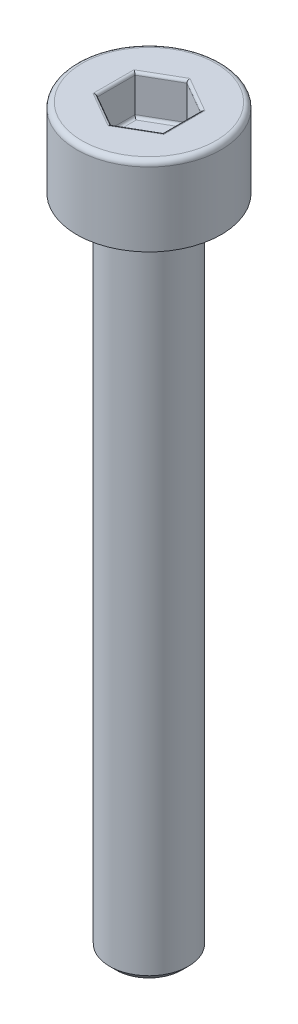
ISO-10303-21;
HEADER;
FILE_DESCRIPTION(('STEP AP214'),'2;1');
FILE_NAME('part.step','',(''),(''),'','','');
FILE_SCHEMA(('AUTOMOTIVE_DESIGN { 1 0 10303 214 1 1 1 1 }'));
ENDSEC;
DATA;
#1=APPLICATION_CONTEXT('core data for automotive mechanical design processes');
#2=APPLICATION_PROTOCOL_DEFINITION('international standard','automotive_design',2000,#1);
#3=PRODUCT_CONTEXT('',#1,'mechanical');
#4=PRODUCT('Part','Part','',(#3));
#5=PRODUCT_RELATED_PRODUCT_CATEGORY('part','',(#4));
#6=PRODUCT_DEFINITION_FORMATION('','',#4);
#7=PRODUCT_DEFINITION_CONTEXT('part definition',#1,'design');
#8=PRODUCT_DEFINITION('design','',#6,#7);
#9=PRODUCT_DEFINITION_SHAPE('','',#8);
#10=(LENGTH_UNIT() NAMED_UNIT(*) SI_UNIT(.MILLI.,.METRE.));
#11=(NAMED_UNIT(*) PLANE_ANGLE_UNIT() SI_UNIT($,.RADIAN.));
#12=(NAMED_UNIT(*) SI_UNIT($,.STERADIAN.) SOLID_ANGLE_UNIT());
#13=UNCERTAINTY_MEASURE_WITH_UNIT(LENGTH_MEASURE(1.E-05),#10,'distance_accuracy_value','');
#14=(GEOMETRIC_REPRESENTATION_CONTEXT(3) GLOBAL_UNCERTAINTY_ASSIGNED_CONTEXT((#13)) GLOBAL_UNIT_ASSIGNED_CONTEXT((#10,
#11,#12)) REPRESENTATION_CONTEXT('',''));
#15=CARTESIAN_POINT('',(0.,0.,0.));
#16=DIRECTION('',(0.,0.,1.));
#17=DIRECTION('',(1.,0.,0.));
#18=AXIS2_PLACEMENT_3D('',#15,#16,#17);
#19=CARTESIAN_POINT('',(0.,-28.,0.));
#20=DIRECTION('',(0.,-1.,0.));
#21=DIRECTION('',(0.,0.,-1.));
#22=AXIS2_PLACEMENT_3D('',#19,#20,#21);
#23=PLANE('',#22);
#24=CARTESIAN_POINT('',(0.,-28.,0.));
#25=DIRECTION('',(0.,-1.,0.));
#26=DIRECTION('',(0.,0.,-1.));
#27=AXIS2_PLACEMENT_3D('',#24,#25,#26);
#28=CIRCLE('',#27,1.25);
#29=CARTESIAN_POINT('',(0.,-28.,-1.25));
#30=VERTEX_POINT('',#29);
#31=EDGE_CURVE('E276',#30,#30,#28,.T.);
#32=ORIENTED_EDGE('',*,*,#31,.T.);
#33=EDGE_LOOP('',(#32));
#34=FACE_BOUND('',#33,.T.);
#35=ADVANCED_FACE('F48',(#34),#23,.T.);
#36=CARTESIAN_POINT('',(0.,0.,0.));
#37=DIRECTION('',(0.,1.,0.));
#38=DIRECTION('',(0.,0.,1.));
#39=AXIS2_PLACEMENT_3D('',#36,#37,#38);
#40=CYLINDRICAL_SURFACE('',#39,1.5);
#41=CARTESIAN_POINT('',(0.,-3.25,0.));
#42=DIRECTION('',(0.,-1.,0.));
#43=DIRECTION('',(0.,0.,-1.));
#44=AXIS2_PLACEMENT_3D('',#41,#42,#43);
#45=CIRCLE('',#44,1.5);
#46=CARTESIAN_POINT('',(0.,-3.25,-1.5));
#47=VERTEX_POINT('',#46);
#48=EDGE_CURVE('E273',#47,#47,#45,.T.);
#49=ORIENTED_EDGE('',*,*,#48,.T.);
#50=EDGE_LOOP('',(#49));
#51=FACE_BOUND('',#50,.T.);
#52=CARTESIAN_POINT('',(0.,-27.75,0.));
#53=DIRECTION('',(0.,-1.,0.));
#54=DIRECTION('',(0.,0.,-1.));
#55=AXIS2_PLACEMENT_3D('',#52,#53,#54);
#56=CIRCLE('',#55,1.5);
#57=CARTESIAN_POINT('',(0.,-27.75,-1.5));
#58=VERTEX_POINT('',#57);
#59=EDGE_CURVE('E270',#58,#58,#56,.F.);
#60=ORIENTED_EDGE('',*,*,#59,.T.);
#61=EDGE_LOOP('',(#60));
#62=FACE_BOUND('',#61,.T.);
#63=ADVANCED_FACE('F302',(#51,#62),#40,.T.);
#64=CARTESIAN_POINT('',(-1.5,-3.,0.));
#65=DIRECTION('',(0.,-1.,0.));
#66=DIRECTION('',(0.,0.,-1.));
#67=AXIS2_PLACEMENT_3D('',#64,#65,#66);
#68=PLANE('',#67);
#69=CARTESIAN_POINT('',(0.,-3.,0.));
#70=DIRECTION('',(0.,-1.,0.));
#71=DIRECTION('',(0.,0.,-1.));
#72=AXIS2_PLACEMENT_3D('',#69,#70,#71);
#73=CIRCLE('',#72,1.75);
#74=CARTESIAN_POINT('',(0.,-3.,-1.75));
#75=VERTEX_POINT('',#74);
#76=EDGE_CURVE('E267',#75,#75,#73,.F.);
#77=ORIENTED_EDGE('',*,*,#76,.T.);
#78=EDGE_LOOP('',(#77));
#79=FACE_BOUND('',#78,.T.);
#80=CARTESIAN_POINT('',(0.,-3.,0.));
#81=DIRECTION('',(0.,1.,0.));
#82=DIRECTION('',(0.,0.,1.));
#83=AXIS2_PLACEMENT_3D('',#80,#81,#82);
#84=CIRCLE('',#83,2.75);
#85=CARTESIAN_POINT('',(0.,-3.,2.75));
#86=VERTEX_POINT('',#85);
#87=EDGE_CURVE('E264',#86,#86,#84,.T.);
#88=ORIENTED_EDGE('',*,*,#87,.F.);
#89=EDGE_LOOP('',(#88));
#90=FACE_BOUND('',#89,.T.);
#91=ADVANCED_FACE('F308',(#79,#90),#68,.T.);
#92=CARTESIAN_POINT('',(0.,0.,0.));
#93=DIRECTION('',(0.,1.,0.));
#94=DIRECTION('',(0.,0.,1.));
#95=AXIS2_PLACEMENT_3D('',#92,#93,#94);
#96=CYLINDRICAL_SURFACE('',#95,2.75);
#97=CARTESIAN_POINT('',(0.,-0.2,0.));
#98=DIRECTION('',(0.,1.,0.));
#99=DIRECTION('',(0.,0.,1.));
#100=AXIS2_PLACEMENT_3D('',#97,#98,#99);
#101=CIRCLE('',#100,2.75);
#102=CARTESIAN_POINT('',(0.,-0.2,2.75));
#103=VERTEX_POINT('',#102);
#104=EDGE_CURVE('E174',#103,#103,#101,.F.);
#105=ORIENTED_EDGE('',*,*,#104,.T.);
#106=EDGE_LOOP('',(#105));
#107=FACE_BOUND('',#106,.T.);
#108=ORIENTED_EDGE('',*,*,#87,.T.);
#109=EDGE_LOOP('',(#108));
#110=FACE_BOUND('',#109,.T.);
#111=ADVANCED_FACE('F318',(#107,#110),#96,.T.);
#112=CARTESIAN_POINT('',(-2.75,0.,0.));
#113=DIRECTION('',(0.,1.,0.));
#114=DIRECTION('',(0.,0.,1.));
#115=AXIS2_PLACEMENT_3D('',#112,#113,#114);
#116=PLANE('',#115);
#117=DIRECTION('',(0.,0.,1.));
#118=VECTOR('',#117,1.);
#119=CARTESIAN_POINT('',(-1.35,0.,-0.721687836487034));
#120=LINE('',#119,#118);
#121=CARTESIAN_POINT('',(-1.35,0.,0.779422863405994));
#122=VERTEX_POINT('',#121);
#123=CARTESIAN_POINT('',(-1.35,0.,-0.779422863405996));
#124=VERTEX_POINT('',#123);
#125=EDGE_CURVE('E190',#122,#124,#120,.F.);
#126=ORIENTED_EDGE('',*,*,#125,.T.);
#127=DIRECTION('',(-0.866025403784439,0.,0.5));
#128=VECTOR('',#127,1.);
#129=CARTESIAN_POINT('',(-0.0500000000000009,0.,-1.52997821335251));
#130=LINE('',#129,#128);
#131=CARTESIAN_POINT('',(0.,0.,-1.55884572681199));
#132=VERTEX_POINT('',#131);
#133=EDGE_CURVE('E149',#124,#132,#130,.F.);
#134=ORIENTED_EDGE('',*,*,#133,.T.);
#135=DIRECTION('',(-0.866025403784439,0.,-0.5));
#136=VECTOR('',#135,1.);
#137=CARTESIAN_POINT('',(1.3,0.,-0.808290376865478));
#138=LINE('',#137,#136);
#139=CARTESIAN_POINT('',(1.35,0.,-0.779422863405996));
#140=VERTEX_POINT('',#139);
#141=EDGE_CURVE('E176',#132,#140,#138,.F.);
#142=ORIENTED_EDGE('',*,*,#141,.T.);
#143=DIRECTION('',(0.,0.,-1.));
#144=VECTOR('',#143,1.);
#145=CARTESIAN_POINT('',(1.35,0.,0.721687836487032));
#146=LINE('',#145,#144);
#147=CARTESIAN_POINT('',(1.35,0.,0.779422863405995));
#148=VERTEX_POINT('',#147);
#149=EDGE_CURVE('E184',#140,#148,#146,.F.);
#150=ORIENTED_EDGE('',*,*,#149,.T.);
#151=DIRECTION('',(0.866025403784439,0.,-0.5));
#152=VECTOR('',#151,1.);
#153=CARTESIAN_POINT('',(0.0499999999999991,0.,1.52997821335251));
#154=LINE('',#153,#152);
#155=CARTESIAN_POINT('',(0.,0.,1.55884572681199));
#156=VERTEX_POINT('',#155);
#157=EDGE_CURVE('E186',#148,#156,#154,.F.);
#158=ORIENTED_EDGE('',*,*,#157,.T.);
#159=DIRECTION('',(0.866025403784439,0.,0.5));
#160=VECTOR('',#159,1.);
#161=CARTESIAN_POINT('',(-1.3,0.,0.808290376865476));
#162=LINE('',#161,#160);
#163=EDGE_CURVE('E188',#156,#122,#162,.F.);
#164=ORIENTED_EDGE('',*,*,#163,.T.);
#165=EDGE_LOOP('',(#126,#134,#142,#150,#158,#164));
#166=FACE_BOUND('',#165,.T.);
#167=CARTESIAN_POINT('',(0.,0.,0.));
#168=DIRECTION('',(0.,1.,0.));
#169=DIRECTION('',(0.,0.,1.));
#170=AXIS2_PLACEMENT_3D('',#167,#168,#169);
#171=CIRCLE('',#170,2.55);
#172=CARTESIAN_POINT('',(0.,0.,2.55));
#173=VERTEX_POINT('',#172);
#174=EDGE_CURVE('E179',#173,#173,#171,.T.);
#175=ORIENTED_EDGE('',*,*,#174,.T.);
#176=EDGE_LOOP('',(#175));
#177=FACE_BOUND('',#176,.T.);
#178=ADVANCED_FACE('F281',(#166,#177),#116,.T.);
#179=CARTESIAN_POINT('',(0.,-3.,0.));
#180=DIRECTION('',(0.,1.,0.));
#181=DIRECTION('',(0.,0.,1.));
#182=AXIS2_PLACEMENT_3D('',#179,#180,#181);
#183=CONICAL_SURFACE('',#182,1.75,0.785398163397452);
#184=ORIENTED_EDGE('',*,*,#48,.F.);
#185=EDGE_LOOP('',(#184));
#186=FACE_BOUND('',#185,.T.);
#187=ORIENTED_EDGE('',*,*,#76,.F.);
#188=EDGE_LOOP('',(#187));
#189=FACE_BOUND('',#188,.T.);
#190=ADVANCED_FACE('F296',(#186,#189),#183,.T.);
#191=CARTESIAN_POINT('',(0.,-27.75,0.));
#192=DIRECTION('',(0.,1.,0.));
#193=DIRECTION('',(0.,0.,1.));
#194=AXIS2_PLACEMENT_3D('',#191,#192,#193);
#195=CONICAL_SURFACE('',#194,1.5,0.785398163397444);
#196=ORIENTED_EDGE('',*,*,#31,.F.);
#197=EDGE_LOOP('',(#196));
#198=FACE_BOUND('',#197,.T.);
#199=ORIENTED_EDGE('',*,*,#59,.F.);
#200=EDGE_LOOP('',(#199));
#201=FACE_BOUND('',#200,.T.);
#202=ADVANCED_FACE('F286',(#198,#201),#195,.T.);
#203=CARTESIAN_POINT('',(0.,-0.2,0.));
#204=DIRECTION('',(0.,1.,0.));
#205=DIRECTION('',(0.,0.,1.));
#206=AXIS2_PLACEMENT_3D('',#203,#204,#205);
#207=TOROIDAL_SURFACE('',#206,2.55,0.2);
#208=ORIENTED_EDGE('',*,*,#104,.F.);
#209=EDGE_LOOP('',(#208));
#210=FACE_BOUND('',#209,.T.);
#211=ORIENTED_EDGE('',*,*,#174,.F.);
#212=EDGE_LOOP('',(#211));
#213=FACE_BOUND('',#212,.T.);
#214=ADVANCED_FACE('F283',(#210,#213),#207,.T.);
#215=CARTESIAN_POINT('',(1.25,-1.5,-0.721687836487034));
#216=DIRECTION('',(0.5,0.,-0.866025403784439));
#217=DIRECTION('',(-0.866025403784439,0.,-0.5));
#218=AXIS2_PLACEMENT_3D('',#215,#216,#217);
#219=PLANE('',#218);
#220=DIRECTION('',(0.,1.,0.));
#221=VECTOR('',#220,1.);
#222=CARTESIAN_POINT('',(1.25,-1.5,-0.721687836487034));
#223=LINE('',#222,#221);
#224=CARTESIAN_POINT('',(1.25,-1.4,-0.721687836487034));
#225=VERTEX_POINT('',#224);
#226=CARTESIAN_POINT('',(1.25,-0.1,-0.721687836487034));
#227=VERTEX_POINT('',#226);
#228=EDGE_CURVE('E258',#225,#227,#223,.T.);
#229=ORIENTED_EDGE('',*,*,#228,.T.);
#230=DIRECTION('',(-0.866025403784439,0.,-0.5));
#231=VECTOR('',#230,1.);
#232=CARTESIAN_POINT('',(0.,-0.1,-1.44337567297407));
#233=LINE('',#232,#231);
#234=CARTESIAN_POINT('',(0.,-0.1,-1.44337567297407));
#235=VERTEX_POINT('',#234);
#236=EDGE_CURVE('E210',#227,#235,#233,.T.);
#237=ORIENTED_EDGE('',*,*,#236,.T.);
#238=DIRECTION('',(0.,1.,0.));
#239=VECTOR('',#238,1.);
#240=CARTESIAN_POINT('',(0.,-1.5,-1.44337567297407));
#241=LINE('',#240,#239);
#242=CARTESIAN_POINT('',(0.,-1.4,-1.44337567297407));
#243=VERTEX_POINT('',#242);
#244=EDGE_CURVE('E160',#243,#235,#241,.T.);
#245=ORIENTED_EDGE('',*,*,#244,.F.);
#246=DIRECTION('',(-0.866025403784439,0.,-0.5));
#247=VECTOR('',#246,1.);
#248=CARTESIAN_POINT('',(1.25,-1.4,-0.721687836487034));
#249=LINE('',#248,#247);
#250=EDGE_CURVE('E208',#243,#225,#249,.F.);
#251=ORIENTED_EDGE('',*,*,#250,.T.);
#252=EDGE_LOOP('',(#229,#237,#245,#251));
#253=FACE_BOUND('',#252,.T.);
#254=ADVANCED_FACE('F285',(#253),#219,.F.);
#255=CARTESIAN_POINT('',(1.25,-1.5,0.721687836487032));
#256=DIRECTION('',(1.,0.,0.));
#257=DIRECTION('',(0.,0.,-1.));
#258=AXIS2_PLACEMENT_3D('',#255,#256,#257);
#259=PLANE('',#258);
#260=DIRECTION('',(0.,1.,0.));
#261=VECTOR('',#260,1.);
#262=CARTESIAN_POINT('',(1.25,-1.5,0.721687836487032));
#263=LINE('',#262,#261);
#264=CARTESIAN_POINT('',(1.25,-1.4,0.721687836487032));
#265=VERTEX_POINT('',#264);
#266=CARTESIAN_POINT('',(1.25,-0.1,0.721687836487032));
#267=VERTEX_POINT('',#266);
#268=EDGE_CURVE('E255',#265,#267,#263,.T.);
#269=ORIENTED_EDGE('',*,*,#268,.T.);
#270=DIRECTION('',(0.,0.,-1.));
#271=VECTOR('',#270,1.);
#272=CARTESIAN_POINT('',(1.25,-0.1,-0.721687836487034));
#273=LINE('',#272,#271);
#274=EDGE_CURVE('E206',#267,#227,#273,.T.);
#275=ORIENTED_EDGE('',*,*,#274,.T.);
#276=ORIENTED_EDGE('',*,*,#228,.F.);
#277=DIRECTION('',(0.,0.,-1.));
#278=VECTOR('',#277,1.);
#279=CARTESIAN_POINT('',(1.25,-1.4,0.721687836487032));
#280=LINE('',#279,#278);
#281=EDGE_CURVE('E203',#225,#265,#280,.F.);
#282=ORIENTED_EDGE('',*,*,#281,.T.);
#283=EDGE_LOOP('',(#269,#275,#276,#282));
#284=FACE_BOUND('',#283,.T.);
#285=ADVANCED_FACE('F293',(#284),#259,.F.);
#286=CARTESIAN_POINT('',(0.,-1.5,1.44337567297406));
#287=DIRECTION('',(0.5,0.,0.866025403784439));
#288=DIRECTION('',(0.866025403784439,0.,-0.5));
#289=AXIS2_PLACEMENT_3D('',#286,#287,#288);
#290=PLANE('',#289);
#291=DIRECTION('',(0.,1.,0.));
#292=VECTOR('',#291,1.);
#293=CARTESIAN_POINT('',(0.,-1.5,1.44337567297406));
#294=LINE('',#293,#292);
#295=CARTESIAN_POINT('',(0.,-1.4,1.44337567297406));
#296=VERTEX_POINT('',#295);
#297=CARTESIAN_POINT('',(0.,-0.1,1.44337567297406));
#298=VERTEX_POINT('',#297);
#299=EDGE_CURVE('E252',#296,#298,#294,.T.);
#300=ORIENTED_EDGE('',*,*,#299,.T.);
#301=DIRECTION('',(0.866025403784439,0.,-0.5));
#302=VECTOR('',#301,1.);
#303=CARTESIAN_POINT('',(1.25,-0.1,0.721687836487032));
#304=LINE('',#303,#302);
#305=EDGE_CURVE('E201',#298,#267,#304,.T.);
#306=ORIENTED_EDGE('',*,*,#305,.T.);
#307=ORIENTED_EDGE('',*,*,#268,.F.);
#308=DIRECTION('',(0.866025403784439,0.,-0.5));
#309=VECTOR('',#308,1.);
#310=CARTESIAN_POINT('',(0.,-1.4,1.44337567297406));
#311=LINE('',#310,#309);
#312=EDGE_CURVE('E199',#265,#296,#311,.F.);
#313=ORIENTED_EDGE('',*,*,#312,.T.);
#314=EDGE_LOOP('',(#300,#306,#307,#313));
#315=FACE_BOUND('',#314,.T.);
#316=ADVANCED_FACE('F342',(#315),#290,.F.);
#317=CARTESIAN_POINT('',(-1.25,-1.5,0.721687836487032));
#318=DIRECTION('',(-0.5,0.,0.866025403784439));
#319=DIRECTION('',(0.866025403784439,0.,0.5));
#320=AXIS2_PLACEMENT_3D('',#317,#318,#319);
#321=PLANE('',#320);
#322=DIRECTION('',(0.,1.,0.));
#323=VECTOR('',#322,1.);
#324=CARTESIAN_POINT('',(-1.25,-1.5,0.721687836487032));
#325=LINE('',#324,#323);
#326=CARTESIAN_POINT('',(-1.25,-1.4,0.721687836487032));
#327=VERTEX_POINT('',#326);
#328=CARTESIAN_POINT('',(-1.25,-0.1,0.721687836487032));
#329=VERTEX_POINT('',#328);
#330=EDGE_CURVE('E143',#327,#329,#325,.T.);
#331=ORIENTED_EDGE('',*,*,#330,.T.);
#332=DIRECTION('',(0.866025403784439,0.,0.5));
#333=VECTOR('',#332,1.);
#334=CARTESIAN_POINT('',(0.,-0.1,1.44337567297406));
#335=LINE('',#334,#333);
#336=EDGE_CURVE('E197',#329,#298,#335,.T.);
#337=ORIENTED_EDGE('',*,*,#336,.T.);
#338=ORIENTED_EDGE('',*,*,#299,.F.);
#339=DIRECTION('',(0.866025403784439,0.,0.5));
#340=VECTOR('',#339,1.);
#341=CARTESIAN_POINT('',(-1.25,-1.4,0.721687836487032));
#342=LINE('',#341,#340);
#343=EDGE_CURVE('E195',#296,#327,#342,.F.);
#344=ORIENTED_EDGE('',*,*,#343,.T.);
#345=EDGE_LOOP('',(#331,#337,#338,#344));
#346=FACE_BOUND('',#345,.T.);
#347=ADVANCED_FACE('F249',(#346),#321,.F.);
#348=CARTESIAN_POINT('',(-1.25,-1.5,-0.721687836487034));
#349=DIRECTION('',(-1.,0.,0.));
#350=DIRECTION('',(0.,0.,1.));
#351=AXIS2_PLACEMENT_3D('',#348,#349,#350);
#352=PLANE('',#351);
#353=DIRECTION('',(0.,1.,0.));
#354=VECTOR('',#353,1.);
#355=CARTESIAN_POINT('',(-1.25,-1.5,-0.721687836487034));
#356=LINE('',#355,#354);
#357=CARTESIAN_POINT('',(-1.25,-1.4,-0.721687836487034));
#358=VERTEX_POINT('',#357);
#359=CARTESIAN_POINT('',(-1.25,-0.1,-0.721687836487034));
#360=VERTEX_POINT('',#359);
#361=EDGE_CURVE('E141',#358,#360,#356,.T.);
#362=ORIENTED_EDGE('',*,*,#361,.T.);
#363=DIRECTION('',(0.,0.,1.));
#364=VECTOR('',#363,1.);
#365=CARTESIAN_POINT('',(-1.25,-0.1,0.721687836487032));
#366=LINE('',#365,#364);
#367=EDGE_CURVE('E148',#360,#329,#366,.T.);
#368=ORIENTED_EDGE('',*,*,#367,.T.);
#369=ORIENTED_EDGE('',*,*,#330,.F.);
#370=DIRECTION('',(0.,0.,1.));
#371=VECTOR('',#370,1.);
#372=CARTESIAN_POINT('',(-1.25,-1.4,-0.721687836487034));
#373=LINE('',#372,#371);
#374=EDGE_CURVE('E138',#327,#358,#373,.F.);
#375=ORIENTED_EDGE('',*,*,#374,.T.);
#376=EDGE_LOOP('',(#362,#368,#369,#375));
#377=FACE_BOUND('',#376,.T.);
#378=ADVANCED_FACE('F140',(#377),#352,.F.);
#379=CARTESIAN_POINT('',(0.,-1.5,-1.44337567297407));
#380=DIRECTION('',(-0.5,0.,-0.866025403784439));
#381=DIRECTION('',(-0.866025403784439,0.,0.5));
#382=AXIS2_PLACEMENT_3D('',#379,#380,#381);
#383=PLANE('',#382);
#384=ORIENTED_EDGE('',*,*,#244,.T.);
#385=DIRECTION('',(-0.866025403784439,0.,0.5));
#386=VECTOR('',#385,1.);
#387=CARTESIAN_POINT('',(-1.25,-0.1,-0.721687836487033));
#388=LINE('',#387,#386);
#389=EDGE_CURVE('E159',#235,#360,#388,.T.);
#390=ORIENTED_EDGE('',*,*,#389,.T.);
#391=ORIENTED_EDGE('',*,*,#361,.F.);
#392=DIRECTION('',(-0.866025403784439,0.,0.5));
#393=VECTOR('',#392,1.);
#394=CARTESIAN_POINT('',(0.,-1.4,-1.44337567297407));
#395=LINE('',#394,#393);
#396=EDGE_CURVE('E156',#358,#243,#395,.F.);
#397=ORIENTED_EDGE('',*,*,#396,.T.);
#398=EDGE_LOOP('',(#384,#390,#391,#397));
#399=FACE_BOUND('',#398,.T.);
#400=ADVANCED_FACE('F154',(#399),#383,.F.);
#401=CARTESIAN_POINT('',(1.25,-1.5,-0.721687836487033));
#402=DIRECTION('',(0.,-1.,0.));
#403=DIRECTION('',(0.,0.,-1.));
#404=AXIS2_PLACEMENT_3D('',#401,#402,#403);
#405=PLANE('',#404);
#406=DIRECTION('',(0.866025403784439,0.,-0.5));
#407=VECTOR('',#406,1.);
#408=CARTESIAN_POINT('',(1.2,-1.5,0.635085296108589));
#409=LINE('',#408,#407);
#410=CARTESIAN_POINT('',(0.,-1.5,1.32790561913614));
#411=VERTEX_POINT('',#410);
#412=CARTESIAN_POINT('',(1.15,-1.5,0.66395280956807));
#413=VERTEX_POINT('',#412);
#414=EDGE_CURVE('E57',#411,#413,#409,.T.);
#415=ORIENTED_EDGE('',*,*,#414,.T.);
#416=DIRECTION('',(0.,0.,-1.));
#417=VECTOR('',#416,1.);
#418=CARTESIAN_POINT('',(1.15,-1.5,-0.721687836487034));
#419=LINE('',#418,#417);
#420=CARTESIAN_POINT('',(1.15,-1.5,-0.663952809568071));
#421=VERTEX_POINT('',#420);
#422=EDGE_CURVE('E13',#413,#421,#419,.T.);
#423=ORIENTED_EDGE('',*,*,#422,.T.);
#424=DIRECTION('',(-0.866025403784439,0.,-0.5));
#425=VECTOR('',#424,1.);
#426=CARTESIAN_POINT('',(-0.050000000000001,-1.5,-1.35677313259562));
#427=LINE('',#426,#425);
#428=CARTESIAN_POINT('',(0.,-1.5,-1.32790561913614));
#429=VERTEX_POINT('',#428);
#430=EDGE_CURVE('E212',#421,#429,#427,.T.);
#431=ORIENTED_EDGE('',*,*,#430,.T.);
#432=DIRECTION('',(-0.866025403784439,0.,0.5));
#433=VECTOR('',#432,1.);
#434=CARTESIAN_POINT('',(-1.2,-1.5,-0.635085296108589));
#435=LINE('',#434,#433);
#436=CARTESIAN_POINT('',(-1.15,-1.5,-0.663952809568071));
#437=VERTEX_POINT('',#436);
#438=EDGE_CURVE('E214',#429,#437,#435,.T.);
#439=ORIENTED_EDGE('',*,*,#438,.T.);
#440=DIRECTION('',(0.,0.,1.));
#441=VECTOR('',#440,1.);
#442=CARTESIAN_POINT('',(-1.15,-1.5,0.721687836487032));
#443=LINE('',#442,#441);
#444=CARTESIAN_POINT('',(-1.15,-1.5,0.66395280956807));
#445=VERTEX_POINT('',#444);
#446=EDGE_CURVE('E165',#437,#445,#443,.T.);
#447=ORIENTED_EDGE('',*,*,#446,.T.);
#448=DIRECTION('',(0.866025403784439,0.,0.5));
#449=VECTOR('',#448,1.);
#450=CARTESIAN_POINT('',(0.049999999999999,-1.5,1.35677313259562));
#451=LINE('',#450,#449);
#452=EDGE_CURVE('E68',#445,#411,#451,.T.);
#453=ORIENTED_EDGE('',*,*,#452,.T.);
#454=EDGE_LOOP('',(#415,#423,#431,#439,#447,#453));
#455=FACE_BOUND('',#454,.T.);
#456=ADVANCED_FACE('F337',(#455),#405,.F.);
#457=CARTESIAN_POINT('',(0.0499999999999991,-0.1,1.52997821335251));
#458=DIRECTION('',(-0.866025403784439,0.,0.5));
#459=DIRECTION('',(0.5,0.,0.866025403784439));
#460=AXIS2_PLACEMENT_3D('',#457,#458,#459);
#461=CYLINDRICAL_SURFACE('',#460,0.1);
#462=CARTESIAN_POINT('',(0.,-0.1,1.55884572681199));
#463=DIRECTION('',(-1.,0.,0.));
#464=DIRECTION('',(0.,0.,-1.));
#465=AXIS2_PLACEMENT_3D('',#462,#463,#464);
#466=ELLIPSE('',#465,0.115470053837925,0.1);
#467=EDGE_CURVE('E229',#156,#298,#466,.T.);
#468=ORIENTED_EDGE('',*,*,#467,.F.);
#469=ORIENTED_EDGE('',*,*,#157,.F.);
#470=CARTESIAN_POINT('',(1.35,-0.1,0.779422863405995));
#471=DIRECTION('',(-0.5,0.,0.866025403784439));
#472=DIRECTION('',(-0.866025403784439,0.,-0.5));
#473=AXIS2_PLACEMENT_3D('',#470,#471,#472);
#474=ELLIPSE('',#473,0.115470053837925,0.1);
#475=EDGE_CURVE('E232',#267,#148,#474,.F.);
#476=ORIENTED_EDGE('',*,*,#475,.F.);
#477=ORIENTED_EDGE('',*,*,#305,.F.);
#478=EDGE_LOOP('',(#468,#469,#476,#477));
#479=FACE_BOUND('',#478,.T.);
#480=ADVANCED_FACE('F349',(#479),#461,.T.);
#481=CARTESIAN_POINT('',(1.35,-0.1,0.721687836487032));
#482=DIRECTION('',(0.,0.,1.));
#483=DIRECTION('',(1.,0.,0.));
#484=AXIS2_PLACEMENT_3D('',#481,#482,#483);
#485=CYLINDRICAL_SURFACE('',#484,0.1);
#486=ORIENTED_EDGE('',*,*,#475,.T.);
#487=ORIENTED_EDGE('',*,*,#149,.F.);
#488=CARTESIAN_POINT('',(1.35,-0.1,-0.779422863405996));
#489=DIRECTION('',(0.5,0.,0.866025403784439));
#490=DIRECTION('',(-0.866025403784439,0.,0.5));
#491=AXIS2_PLACEMENT_3D('',#488,#489,#490);
#492=ELLIPSE('',#491,0.115470053837925,0.1);
#493=EDGE_CURVE('E226',#227,#140,#492,.F.);
#494=ORIENTED_EDGE('',*,*,#493,.F.);
#495=ORIENTED_EDGE('',*,*,#274,.F.);
#496=EDGE_LOOP('',(#486,#487,#494,#495));
#497=FACE_BOUND('',#496,.T.);
#498=ADVANCED_FACE('F353',(#497),#485,.T.);
#499=CARTESIAN_POINT('',(-1.3,-0.1,0.808290376865476));
#500=DIRECTION('',(-0.866025403784439,0.,-0.5));
#501=DIRECTION('',(-0.5,0.,0.866025403784439));
#502=AXIS2_PLACEMENT_3D('',#499,#500,#501);
#503=CYLINDRICAL_SURFACE('',#502,0.1);
#504=ORIENTED_EDGE('',*,*,#467,.T.);
#505=ORIENTED_EDGE('',*,*,#336,.F.);
#506=CARTESIAN_POINT('',(-1.35,-0.1,0.779422863405994));
#507=DIRECTION('',(-0.5,0.,-0.866025403784439));
#508=DIRECTION('',(0.866025403784439,0.,-0.5));
#509=AXIS2_PLACEMENT_3D('',#506,#507,#508);
#510=ELLIPSE('',#509,0.115470053837925,0.1);
#511=EDGE_CURVE('E223',#122,#329,#510,.T.);
#512=ORIENTED_EDGE('',*,*,#511,.F.);
#513=ORIENTED_EDGE('',*,*,#163,.F.);
#514=EDGE_LOOP('',(#504,#505,#512,#513));
#515=FACE_BOUND('',#514,.T.);
#516=ADVANCED_FACE('F359',(#515),#503,.T.);
#517=CARTESIAN_POINT('',(1.3,-0.1,-0.808290376865478));
#518=DIRECTION('',(0.866025403784439,0.,0.5));
#519=DIRECTION('',(0.5,0.,-0.866025403784439));
#520=AXIS2_PLACEMENT_3D('',#517,#518,#519);
#521=CYLINDRICAL_SURFACE('',#520,0.1);
#522=ORIENTED_EDGE('',*,*,#493,.T.);
#523=ORIENTED_EDGE('',*,*,#141,.F.);
#524=CARTESIAN_POINT('',(0.,-0.1,-1.55884572681199));
#525=DIRECTION('',(1.,0.,0.));
#526=DIRECTION('',(0.,0.,-1.));
#527=AXIS2_PLACEMENT_3D('',#524,#525,#526);
#528=ELLIPSE('',#527,0.115470053837925,0.1);
#529=EDGE_CURVE('E221',#235,#132,#528,.F.);
#530=ORIENTED_EDGE('',*,*,#529,.F.);
#531=ORIENTED_EDGE('',*,*,#236,.F.);
#532=EDGE_LOOP('',(#522,#523,#530,#531));
#533=FACE_BOUND('',#532,.T.);
#534=ADVANCED_FACE('F389',(#533),#521,.T.);
#535=CARTESIAN_POINT('',(-1.35,-0.1,-0.721687836487034));
#536=DIRECTION('',(0.,0.,-1.));
#537=DIRECTION('',(-1.,0.,0.));
#538=AXIS2_PLACEMENT_3D('',#535,#536,#537);
#539=CYLINDRICAL_SURFACE('',#538,0.1);
#540=ORIENTED_EDGE('',*,*,#511,.T.);
#541=ORIENTED_EDGE('',*,*,#367,.F.);
#542=CARTESIAN_POINT('',(-1.35,-0.1,-0.779422863405996));
#543=DIRECTION('',(0.5,0.,-0.866025403784439));
#544=DIRECTION('',(0.866025403784439,0.,0.5));
#545=AXIS2_PLACEMENT_3D('',#542,#543,#544);
#546=ELLIPSE('',#545,0.115470053837925,0.1);
#547=EDGE_CURVE('E219',#124,#360,#546,.T.);
#548=ORIENTED_EDGE('',*,*,#547,.F.);
#549=ORIENTED_EDGE('',*,*,#125,.F.);
#550=EDGE_LOOP('',(#540,#541,#548,#549));
#551=FACE_BOUND('',#550,.T.);
#552=ADVANCED_FACE('F384',(#551),#539,.T.);
#553=CARTESIAN_POINT('',(-0.0500000000000009,-0.1,-1.52997821335251));
#554=DIRECTION('',(0.866025403784439,0.,-0.5));
#555=DIRECTION('',(-0.5,0.,-0.866025403784439));
#556=AXIS2_PLACEMENT_3D('',#553,#554,#555);
#557=CYLINDRICAL_SURFACE('',#556,0.1);
#558=ORIENTED_EDGE('',*,*,#529,.T.);
#559=ORIENTED_EDGE('',*,*,#133,.F.);
#560=ORIENTED_EDGE('',*,*,#547,.T.);
#561=ORIENTED_EDGE('',*,*,#389,.F.);
#562=EDGE_LOOP('',(#558,#559,#560,#561));
#563=FACE_BOUND('',#562,.T.);
#564=ADVANCED_FACE('F380',(#563),#557,.T.);
#565=CARTESIAN_POINT('',(-1.15,-1.4,-0.721687836487033));
#566=DIRECTION('',(0.,0.,-1.));
#567=DIRECTION('',(-1.,0.,0.));
#568=AXIS2_PLACEMENT_3D('',#565,#566,#567);
#569=CYLINDRICAL_SURFACE('',#568,0.1);
#570=CARTESIAN_POINT('',(-1.15,-1.4,-0.663952809568071));
#571=DIRECTION('',(0.5,0.,-0.866025403784439));
#572=DIRECTION('',(-0.866025403784439,0.,-0.5));
#573=AXIS2_PLACEMENT_3D('',#570,#571,#572);
#574=ELLIPSE('',#573,0.115470053837925,0.1);
#575=EDGE_CURVE('E164',#358,#437,#574,.F.);
#576=ORIENTED_EDGE('',*,*,#575,.F.);
#577=ORIENTED_EDGE('',*,*,#374,.F.);
#578=CARTESIAN_POINT('',(-1.15,-1.4,0.66395280956807));
#579=DIRECTION('',(-0.5,0.,-0.866025403784439));
#580=DIRECTION('',(-0.866025403784439,0.,0.5));
#581=AXIS2_PLACEMENT_3D('',#578,#579,#580);
#582=ELLIPSE('',#581,0.115470053837925,0.1);
#583=EDGE_CURVE('E52',#445,#327,#582,.T.);
#584=ORIENTED_EDGE('',*,*,#583,.F.);
#585=ORIENTED_EDGE('',*,*,#446,.F.);
#586=EDGE_LOOP('',(#576,#577,#584,#585));
#587=FACE_BOUND('',#586,.T.);
#588=ADVANCED_FACE('F50',(#587),#569,.F.);
#589=CARTESIAN_POINT('',(0.0499999999999984,-1.4,1.35677313259562));
#590=DIRECTION('',(-0.866025403784439,0.,-0.5));
#591=DIRECTION('',(-0.5,0.,0.866025403784439));
#592=AXIS2_PLACEMENT_3D('',#589,#590,#591);
#593=CYLINDRICAL_SURFACE('',#592,0.1);
#594=ORIENTED_EDGE('',*,*,#583,.T.);
#595=ORIENTED_EDGE('',*,*,#343,.F.);
#596=CARTESIAN_POINT('',(0.,-1.4,1.32790561913614));
#597=DIRECTION('',(-1.,0.,0.));
#598=DIRECTION('',(0.,0.,1.));
#599=AXIS2_PLACEMENT_3D('',#596,#597,#598);
#600=ELLIPSE('',#599,0.115470053837925,0.1);
#601=EDGE_CURVE('E168',#411,#296,#600,.T.);
#602=ORIENTED_EDGE('',*,*,#601,.F.);
#603=ORIENTED_EDGE('',*,*,#452,.F.);
#604=EDGE_LOOP('',(#594,#595,#602,#603));
#605=FACE_BOUND('',#604,.T.);
#606=ADVANCED_FACE('F246',(#605),#593,.F.);
#607=CARTESIAN_POINT('',(0.674999999999999,-1.4,-1.71761705083914));
#608=DIRECTION('',(0.866025403784439,0.,-0.5));
#609=DIRECTION('',(-0.5,0.,-0.866025403784439));
#610=AXIS2_PLACEMENT_3D('',#607,#608,#609);
#611=CYLINDRICAL_SURFACE('',#610,0.1);
#612=ORIENTED_EDGE('',*,*,#575,.T.);
#613=ORIENTED_EDGE('',*,*,#438,.F.);
#614=CARTESIAN_POINT('',(0.,-1.4,-1.32790561913614));
#615=DIRECTION('',(1.,0.,0.));
#616=DIRECTION('',(0.,0.,-1.));
#617=AXIS2_PLACEMENT_3D('',#614,#615,#616);
#618=ELLIPSE('',#617,0.115470053837925,0.1);
#619=EDGE_CURVE('E172',#243,#429,#618,.F.);
#620=ORIENTED_EDGE('',*,*,#619,.F.);
#621=ORIENTED_EDGE('',*,*,#396,.F.);
#622=EDGE_LOOP('',(#612,#613,#620,#621));
#623=FACE_BOUND('',#622,.T.);
#624=ADVANCED_FACE('F170',(#623),#611,.F.);
#625=CARTESIAN_POINT('',(1.825,-1.4,0.274241377865073));
#626=DIRECTION('',(-0.866025403784439,0.,0.5));
#627=DIRECTION('',(0.5,0.,0.866025403784439));
#628=AXIS2_PLACEMENT_3D('',#625,#626,#627);
#629=CYLINDRICAL_SURFACE('',#628,0.1);
#630=ORIENTED_EDGE('',*,*,#601,.T.);
#631=ORIENTED_EDGE('',*,*,#312,.F.);
#632=CARTESIAN_POINT('',(1.15,-1.4,0.66395280956807));
#633=DIRECTION('',(-0.5,0.,0.866025403784439));
#634=DIRECTION('',(0.866025403784439,0.,0.5));
#635=AXIS2_PLACEMENT_3D('',#632,#633,#634);
#636=ELLIPSE('',#635,0.115470053837925,0.1);
#637=EDGE_CURVE('E237',#413,#265,#636,.T.);
#638=ORIENTED_EDGE('',*,*,#637,.F.);
#639=ORIENTED_EDGE('',*,*,#414,.F.);
#640=EDGE_LOOP('',(#630,#631,#638,#639));
#641=FACE_BOUND('',#640,.T.);
#642=ADVANCED_FACE('F243',(#641),#629,.F.);
#643=CARTESIAN_POINT('',(1.2,-1.4,-0.63508529610859));
#644=DIRECTION('',(0.866025403784439,0.,0.5));
#645=DIRECTION('',(0.5,0.,-0.866025403784439));
#646=AXIS2_PLACEMENT_3D('',#643,#644,#645);
#647=CYLINDRICAL_SURFACE('',#646,0.1);
#648=ORIENTED_EDGE('',*,*,#619,.T.);
#649=ORIENTED_EDGE('',*,*,#430,.F.);
#650=CARTESIAN_POINT('',(1.15,-1.4,-0.663952809568071));
#651=DIRECTION('',(0.5,0.,0.866025403784439));
#652=DIRECTION('',(-0.866025403784439,0.,0.5));
#653=AXIS2_PLACEMENT_3D('',#650,#651,#652);
#654=ELLIPSE('',#653,0.115470053837925,0.1);
#655=EDGE_CURVE('E235',#225,#421,#654,.F.);
#656=ORIENTED_EDGE('',*,*,#655,.F.);
#657=ORIENTED_EDGE('',*,*,#250,.F.);
#658=EDGE_LOOP('',(#648,#649,#656,#657));
#659=FACE_BOUND('',#658,.T.);
#660=ADVANCED_FACE('F368',(#659),#647,.F.);
#661=CARTESIAN_POINT('',(1.15,-1.4,-0.721687836487033));
#662=DIRECTION('',(0.,0.,1.));
#663=DIRECTION('',(1.,0.,0.));
#664=AXIS2_PLACEMENT_3D('',#661,#662,#663);
#665=CYLINDRICAL_SURFACE('',#664,0.1);
#666=ORIENTED_EDGE('',*,*,#637,.T.);
#667=ORIENTED_EDGE('',*,*,#281,.F.);
#668=ORIENTED_EDGE('',*,*,#655,.T.);
#669=ORIENTED_EDGE('',*,*,#422,.F.);
#670=EDGE_LOOP('',(#666,#667,#668,#669));
#671=FACE_BOUND('',#670,.T.);
#672=ADVANCED_FACE('F365',(#671),#665,.F.);
#673=CLOSED_SHELL('',(#35,#63,#91,#111,#178,#190,#202,#214,#254,#285,#316,#347,#378,#400,#456,
#480,#498,#516,#534,#552,#564,#588,#606,#624,#642,#660,#672));
#674=MANIFOLD_SOLID_BREP('B2',#673);
#675=ADVANCED_BREP_SHAPE_REPRESENTATION('',(#18,#674),#14);
#676=SHAPE_DEFINITION_REPRESENTATION(#9,#675);
ENDSEC;
END-ISO-10303-21;
